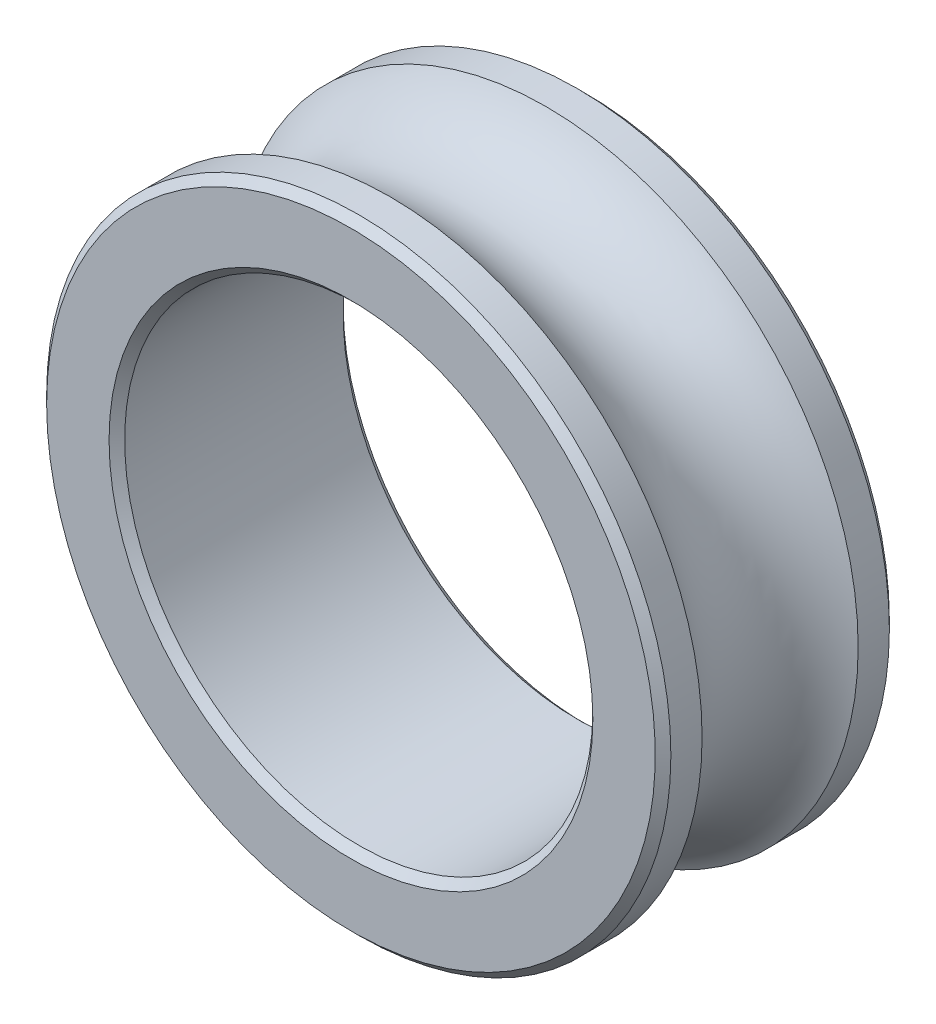
ISO-10303-21;
HEADER;
FILE_DESCRIPTION(('STEP AP214'),'2;1');
FILE_NAME('part.step','',(''),(''),'','','');
FILE_SCHEMA(('AUTOMOTIVE_DESIGN { 1 0 10303 214 1 1 1 1 }'));
ENDSEC;
DATA;
#1=APPLICATION_CONTEXT('core data for automotive mechanical design processes');
#2=APPLICATION_PROTOCOL_DEFINITION('international standard','automotive_design',2000,#1);
#3=PRODUCT_CONTEXT('',#1,'mechanical');
#4=PRODUCT('Part','Part','',(#3));
#5=PRODUCT_RELATED_PRODUCT_CATEGORY('part','',(#4));
#6=PRODUCT_DEFINITION_FORMATION('','',#4);
#7=PRODUCT_DEFINITION_CONTEXT('part definition',#1,'design');
#8=PRODUCT_DEFINITION('design','',#6,#7);
#9=PRODUCT_DEFINITION_SHAPE('','',#8);
#10=(LENGTH_UNIT() NAMED_UNIT(*) SI_UNIT(.MILLI.,.METRE.));
#11=(NAMED_UNIT(*) PLANE_ANGLE_UNIT() SI_UNIT($,.RADIAN.));
#12=(NAMED_UNIT(*) SI_UNIT($,.STERADIAN.) SOLID_ANGLE_UNIT());
#13=UNCERTAINTY_MEASURE_WITH_UNIT(LENGTH_MEASURE(1.E-05),#10,'distance_accuracy_value','');
#14=(GEOMETRIC_REPRESENTATION_CONTEXT(3) GLOBAL_UNCERTAINTY_ASSIGNED_CONTEXT((#13)) GLOBAL_UNIT_ASSIGNED_CONTEXT((#10,
#11,#12)) REPRESENTATION_CONTEXT('',''));
#15=CARTESIAN_POINT('',(0.,0.,0.));
#16=DIRECTION('',(0.,0.,1.));
#17=DIRECTION('',(1.,0.,0.));
#18=AXIS2_PLACEMENT_3D('',#15,#16,#17);
#19=CARTESIAN_POINT('',(0.,0.,0.));
#20=DIRECTION('',(0.,0.,1.));
#21=DIRECTION('',(1.,0.,0.));
#22=AXIS2_PLACEMENT_3D('',#19,#20,#21);
#23=TOROIDAL_SURFACE('',#22,1156.93281819264,290.479016873371);
#24=CARTESIAN_POINT('',(0.,0.,254.));
#25=DIRECTION('',(0.,0.,1.));
#26=DIRECTION('',(1.,0.,0.));
#27=AXIS2_PLACEMENT_3D('',#24,#25,#26);
#28=CIRCLE('',#27,1016.);
#29=CARTESIAN_POINT('',(1016.,0.,254.));
#30=VERTEX_POINT('',#29);
#31=EDGE_CURVE('E67',#30,#30,#28,.T.);
#32=ORIENTED_EDGE('',*,*,#31,.F.);
#33=EDGE_LOOP('',(#32));
#34=FACE_BOUND('',#33,.T.);
#35=CARTESIAN_POINT('',(0.,0.,-254.));
#36=DIRECTION('',(0.,0.,1.));
#37=DIRECTION('',(1.,0.,0.));
#38=AXIS2_PLACEMENT_3D('',#35,#36,#37);
#39=CIRCLE('',#38,1016.);
#40=CARTESIAN_POINT('',(1016.,0.,-254.));
#41=VERTEX_POINT('',#40);
#42=EDGE_CURVE('E70',#41,#41,#39,.T.);
#43=ORIENTED_EDGE('',*,*,#42,.T.);
#44=EDGE_LOOP('',(#43));
#45=FACE_BOUND('',#44,.T.);
#46=ADVANCED_FACE('F35',(#34,#45),#23,.F.);
#47=CARTESIAN_POINT('',(0.,0.,0.));
#48=DIRECTION('',(0.,0.,1.));
#49=DIRECTION('',(1.,0.,0.));
#50=AXIS2_PLACEMENT_3D('',#47,#48,#49);
#51=CYLINDRICAL_SURFACE('',#50,1016.);
#52=CARTESIAN_POINT('',(0.,0.,355.6));
#53=DIRECTION('',(0.,0.,-1.));
#54=DIRECTION('',(-1.,0.,0.));
#55=AXIS2_PLACEMENT_3D('',#52,#53,#54);
#56=CIRCLE('',#55,1016.);
#57=CARTESIAN_POINT('',(-1016.,0.,355.6));
#58=VERTEX_POINT('',#57);
#59=EDGE_CURVE('E58',#58,#58,#56,.T.);
#60=ORIENTED_EDGE('',*,*,#59,.T.);
#61=EDGE_LOOP('',(#60));
#62=FACE_BOUND('',#61,.T.);
#63=ORIENTED_EDGE('',*,*,#31,.T.);
#64=EDGE_LOOP('',(#63));
#65=FACE_BOUND('',#64,.T.);
#66=ADVANCED_FACE('F91',(#62,#65),#51,.T.);
#67=CARTESIAN_POINT('',(0.,762.,381.));
#68=DIRECTION('',(0.,0.,-1.));
#69=DIRECTION('',(-1.,0.,0.));
#70=AXIS2_PLACEMENT_3D('',#67,#68,#69);
#71=PLANE('',#70);
#72=CARTESIAN_POINT('',(0.,0.,381.));
#73=DIRECTION('',(0.,0.,-1.));
#74=DIRECTION('',(-1.,0.,0.));
#75=AXIS2_PLACEMENT_3D('',#72,#73,#74);
#76=CIRCLE('',#75,990.6);
#77=CARTESIAN_POINT('',(-990.6,0.,381.));
#78=VERTEX_POINT('',#77);
#79=EDGE_CURVE('E61',#78,#78,#76,.F.);
#80=ORIENTED_EDGE('',*,*,#79,.T.);
#81=EDGE_LOOP('',(#80));
#82=FACE_BOUND('',#81,.T.);
#83=CARTESIAN_POINT('',(0.,0.,381.));
#84=DIRECTION('',(0.,0.,-1.));
#85=DIRECTION('',(-1.,0.,0.));
#86=AXIS2_PLACEMENT_3D('',#83,#84,#85);
#87=CIRCLE('',#86,787.4);
#88=CARTESIAN_POINT('',(787.4,0.,381.));
#89=VERTEX_POINT('',#88);
#90=EDGE_CURVE('E64',#89,#89,#87,.T.);
#91=ORIENTED_EDGE('',*,*,#90,.T.);
#92=EDGE_LOOP('',(#91));
#93=FACE_BOUND('',#92,.T.);
#94=ADVANCED_FACE('F97',(#82,#93),#71,.F.);
#95=CARTESIAN_POINT('',(0.,0.,0.));
#96=DIRECTION('',(0.,0.,1.));
#97=DIRECTION('',(1.,0.,0.));
#98=AXIS2_PLACEMENT_3D('',#95,#96,#97);
#99=CYLINDRICAL_SURFACE('',#98,762.);
#100=CARTESIAN_POINT('',(0.,0.,355.6));
#101=DIRECTION('',(0.,0.,-1.));
#102=DIRECTION('',(-1.,0.,0.));
#103=AXIS2_PLACEMENT_3D('',#100,#101,#102);
#104=CIRCLE('',#103,762.);
#105=CARTESIAN_POINT('',(762.,0.,355.600000000001));
#106=VERTEX_POINT('',#105);
#107=EDGE_CURVE('E50',#106,#106,#104,.F.);
#108=ORIENTED_EDGE('',*,*,#107,.T.);
#109=EDGE_LOOP('',(#108));
#110=FACE_BOUND('',#109,.T.);
#111=CARTESIAN_POINT('',(0.,0.,-355.6));
#112=DIRECTION('',(0.,0.,1.));
#113=DIRECTION('',(1.,0.,0.));
#114=AXIS2_PLACEMENT_3D('',#111,#112,#113);
#115=CIRCLE('',#114,762.);
#116=CARTESIAN_POINT('',(762.,0.,-355.6));
#117=VERTEX_POINT('',#116);
#118=EDGE_CURVE('E55',#117,#117,#115,.F.);
#119=ORIENTED_EDGE('',*,*,#118,.T.);
#120=EDGE_LOOP('',(#119));
#121=FACE_BOUND('',#120,.T.);
#122=ADVANCED_FACE('F88',(#110,#121),#99,.F.);
#123=CARTESIAN_POINT('',(0.,762.,-381.));
#124=DIRECTION('',(0.,0.,1.));
#125=DIRECTION('',(1.,0.,0.));
#126=AXIS2_PLACEMENT_3D('',#123,#124,#125);
#127=PLANE('',#126);
#128=CARTESIAN_POINT('',(0.,0.,-381.));
#129=DIRECTION('',(0.,0.,1.));
#130=DIRECTION('',(1.,0.,0.));
#131=AXIS2_PLACEMENT_3D('',#128,#129,#130);
#132=CIRCLE('',#131,990.6);
#133=CARTESIAN_POINT('',(990.6,0.,-381.));
#134=VERTEX_POINT('',#133);
#135=EDGE_CURVE('E10',#134,#134,#132,.F.);
#136=ORIENTED_EDGE('',*,*,#135,.T.);
#137=EDGE_LOOP('',(#136));
#138=FACE_BOUND('',#137,.T.);
#139=CARTESIAN_POINT('',(0.,0.,-381.));
#140=DIRECTION('',(0.,0.,1.));
#141=DIRECTION('',(1.,0.,0.));
#142=AXIS2_PLACEMENT_3D('',#139,#140,#141);
#143=CIRCLE('',#142,787.4);
#144=CARTESIAN_POINT('',(787.4,0.,-381.));
#145=VERTEX_POINT('',#144);
#146=EDGE_CURVE('E42',#145,#145,#143,.T.);
#147=ORIENTED_EDGE('',*,*,#146,.T.);
#148=EDGE_LOOP('',(#147));
#149=FACE_BOUND('',#148,.T.);
#150=ADVANCED_FACE('F78',(#138,#149),#127,.F.);
#151=CARTESIAN_POINT('',(0.,0.,0.));
#152=DIRECTION('',(0.,0.,1.));
#153=DIRECTION('',(1.,0.,0.));
#154=AXIS2_PLACEMENT_3D('',#151,#152,#153);
#155=CYLINDRICAL_SURFACE('',#154,1016.);
#156=CARTESIAN_POINT('',(0.,0.,-355.6));
#157=DIRECTION('',(0.,0.,1.));
#158=DIRECTION('',(1.,0.,0.));
#159=AXIS2_PLACEMENT_3D('',#156,#157,#158);
#160=CIRCLE('',#159,1016.);
#161=CARTESIAN_POINT('',(1016.,0.,-355.6));
#162=VERTEX_POINT('',#161);
#163=EDGE_CURVE('E46',#162,#162,#160,.T.);
#164=ORIENTED_EDGE('',*,*,#163,.T.);
#165=EDGE_LOOP('',(#164));
#166=FACE_BOUND('',#165,.T.);
#167=ORIENTED_EDGE('',*,*,#42,.F.);
#168=EDGE_LOOP('',(#167));
#169=FACE_BOUND('',#168,.T.);
#170=ADVANCED_FACE('F75',(#166,#169),#155,.T.);
#171=CARTESIAN_POINT('',(0.,0.,381.));
#172=DIRECTION('',(0.,0.,-1.));
#173=DIRECTION('',(-1.,0.,0.));
#174=AXIS2_PLACEMENT_3D('',#171,#172,#173);
#175=CONICAL_SURFACE('',#174,990.6,0.785398163397457);
#176=ORIENTED_EDGE('',*,*,#59,.F.);
#177=EDGE_LOOP('',(#176));
#178=FACE_BOUND('',#177,.T.);
#179=ORIENTED_EDGE('',*,*,#79,.F.);
#180=EDGE_LOOP('',(#179));
#181=FACE_BOUND('',#180,.T.);
#182=ADVANCED_FACE('F77',(#178,#181),#175,.T.);
#183=CARTESIAN_POINT('',(0.,0.,355.6));
#184=DIRECTION('',(0.,0.,1.));
#185=DIRECTION('',(1.,0.,0.));
#186=AXIS2_PLACEMENT_3D('',#183,#184,#185);
#187=CONICAL_SURFACE('',#186,762.,0.785398163397457);
#188=CARTESIAN_POINT('',(787.4,0.,381.));
#189=CARTESIAN_POINT('',(787.135416666667,0.,380.735416666667));
#190=CARTESIAN_POINT('',(786.870833333333,0.,380.470833333333));
#191=CARTESIAN_POINT('',(786.341666666667,0.,379.941666666667));
#192=CARTESIAN_POINT('',(786.077083333333,0.,379.677083333333));
#193=CARTESIAN_POINT('',(785.547916666667,0.,379.147916666667));
#194=CARTESIAN_POINT('',(785.283333333333,0.,378.883333333333));
#195=CARTESIAN_POINT('',(784.754166666667,0.,378.354166666667));
#196=CARTESIAN_POINT('',(784.489583333333,0.,378.089583333333));
#197=CARTESIAN_POINT('',(783.960416666667,0.,377.560416666667));
#198=CARTESIAN_POINT('',(783.695833333333,0.,377.295833333333));
#199=CARTESIAN_POINT('',(783.166666666667,0.,376.766666666667));
#200=CARTESIAN_POINT('',(782.902083333333,0.,376.502083333333));
#201=CARTESIAN_POINT('',(782.372916666667,0.,375.972916666667));
#202=CARTESIAN_POINT('',(782.108333333333,0.,375.708333333333));
#203=CARTESIAN_POINT('',(781.579166666667,0.,375.179166666667));
#204=CARTESIAN_POINT('',(781.314583333333,0.,374.914583333333));
#205=CARTESIAN_POINT('',(780.785416666667,0.,374.385416666667));
#206=CARTESIAN_POINT('',(780.520833333333,0.,374.120833333334));
#207=CARTESIAN_POINT('',(779.991666666667,0.,373.591666666667));
#208=CARTESIAN_POINT('',(779.727083333333,0.,373.327083333334));
#209=CARTESIAN_POINT('',(779.197916666667,0.,372.797916666667));
#210=CARTESIAN_POINT('',(778.933333333333,0.,372.533333333334));
#211=CARTESIAN_POINT('',(778.404166666667,0.,372.004166666667));
#212=CARTESIAN_POINT('',(778.139583333333,0.,371.739583333334));
#213=CARTESIAN_POINT('',(777.610416666667,0.,371.210416666667));
#214=CARTESIAN_POINT('',(777.345833333333,0.,370.945833333334));
#215=CARTESIAN_POINT('',(776.816666666667,0.,370.416666666667));
#216=CARTESIAN_POINT('',(776.552083333333,0.,370.152083333334));
#217=CARTESIAN_POINT('',(776.022916666667,0.,369.622916666667));
#218=CARTESIAN_POINT('',(775.758333333333,0.,369.358333333334));
#219=CARTESIAN_POINT('',(775.229166666667,0.,368.829166666667));
#220=CARTESIAN_POINT('',(774.964583333333,0.,368.564583333334));
#221=CARTESIAN_POINT('',(774.435416666667,0.,368.035416666667));
#222=CARTESIAN_POINT('',(774.170833333333,0.,367.770833333334));
#223=CARTESIAN_POINT('',(773.641666666667,0.,367.241666666667));
#224=CARTESIAN_POINT('',(773.377083333333,0.,366.977083333334));
#225=CARTESIAN_POINT('',(772.847916666667,0.,366.447916666667));
#226=CARTESIAN_POINT('',(772.583333333333,0.,366.183333333334));
#227=CARTESIAN_POINT('',(772.054166666667,0.,365.654166666667));
#228=CARTESIAN_POINT('',(771.789583333333,0.,365.389583333334));
#229=CARTESIAN_POINT('',(771.260416666667,0.,364.860416666667));
#230=CARTESIAN_POINT('',(770.995833333333,0.,364.595833333334));
#231=CARTESIAN_POINT('',(770.466666666667,0.,364.066666666667));
#232=CARTESIAN_POINT('',(770.202083333333,0.,363.802083333334));
#233=CARTESIAN_POINT('',(769.672916666667,0.,363.272916666667));
#234=CARTESIAN_POINT('',(769.408333333333,0.,363.008333333334));
#235=CARTESIAN_POINT('',(768.879166666667,0.,362.479166666667));
#236=CARTESIAN_POINT('',(768.614583333333,0.,362.214583333334));
#237=CARTESIAN_POINT('',(768.085416666667,0.,361.685416666667));
#238=CARTESIAN_POINT('',(767.820833333333,0.,361.420833333334));
#239=CARTESIAN_POINT('',(767.291666666667,0.,360.891666666667));
#240=CARTESIAN_POINT('',(767.027083333333,0.,360.627083333334));
#241=CARTESIAN_POINT('',(766.497916666667,0.,360.097916666667));
#242=CARTESIAN_POINT('',(766.233333333333,0.,359.833333333334));
#243=CARTESIAN_POINT('',(765.704166666667,0.,359.304166666667));
#244=CARTESIAN_POINT('',(765.439583333333,0.,359.039583333334));
#245=CARTESIAN_POINT('',(764.910416666667,0.,358.510416666667));
#246=CARTESIAN_POINT('',(764.645833333333,0.,358.245833333334));
#247=CARTESIAN_POINT('',(764.116666666667,0.,357.716666666667));
#248=CARTESIAN_POINT('',(763.852083333333,0.,357.452083333334));
#249=CARTESIAN_POINT('',(763.322916666667,0.,356.922916666667));
#250=CARTESIAN_POINT('',(763.058333333333,0.,356.658333333334));
#251=CARTESIAN_POINT('',(762.529166666667,0.,356.129166666667));
#252=CARTESIAN_POINT('',(762.264583333333,0.,355.864583333334));
#253=CARTESIAN_POINT('',(762.,0.,355.6));
#254=B_SPLINE_CURVE_WITH_KNOTS('',3,(#188,#189,#190,#191,#192,#193,#194,#195,#196,#197,#198,
#199,#200,#201,#202,#203,#204,#205,#206,#207,#208,#209,#210,#211,#212,#213,#214,#215,#216,#217,
#218,#219,#220,#221,#222,#223,#224,#225,#226,#227,#228,#229,#230,#231,#232,#233,#234,#235,#236,
#237,#238,#239,#240,#241,#242,#243,#244,#245,#246,#247,#248,#249,#250,#251,#252,#253),
.UNSPECIFIED.,.F.,.F.,(4,2,2,2,2,2,2,2,2,2,2,2,2,2,2,2,2,2,2,2,2,2,2,2,2,2,2,2,2,2,2,2,4),(0.,
1.12253201513358,2.24506403026728,3.36759604540093,4.49012806053451,5.61266007566817,
6.73519209080183,7.85772410593541,8.98025612106907,10.1027881362027,11.2253201513363,
12.34785216647,13.4703841816036,14.5929161967372,15.7154482118709,16.8379802270045,
17.9605122421381,19.0830442572718,20.2055762724054,21.328108287539,22.4506403026727,
23.5731723178063,24.6957043329399,25.8182363480736,26.9407683632072,28.0633003783408,
29.1858323934745,30.3083644086081,31.4308964237417,32.5534284388754,33.675960454009,
34.7984924691426,35.9210244842763),.UNSPECIFIED.);
#255=EDGE_CURVE('BSEAM85',#89,#106,#254,.T.);
#256=ORIENTED_EDGE('',*,*,#90,.F.);
#257=ORIENTED_EDGE('',*,*,#107,.F.);
#258=ORIENTED_EDGE('',*,*,#255,.T.);
#259=ORIENTED_EDGE('',*,*,#255,.F.);
#260=EDGE_LOOP('',(#256,#258,#257,#259));
#261=FACE_BOUND('',#260,.T.);
#262=ADVANCED_FACE('F85',(#261),#187,.F.);
#263=CARTESIAN_POINT('',(0.,0.,-355.6));
#264=DIRECTION('',(0.,0.,1.));
#265=DIRECTION('',(1.,0.,0.));
#266=AXIS2_PLACEMENT_3D('',#263,#264,#265);
#267=CONICAL_SURFACE('',#266,1016.,0.785398163397457);
#268=ORIENTED_EDGE('',*,*,#135,.F.);
#269=EDGE_LOOP('',(#268));
#270=FACE_BOUND('',#269,.T.);
#271=ORIENTED_EDGE('',*,*,#163,.F.);
#272=EDGE_LOOP('',(#271));
#273=FACE_BOUND('',#272,.T.);
#274=ADVANCED_FACE('F104',(#270,#273),#267,.T.);
#275=CARTESIAN_POINT('',(0.,0.,-381.));
#276=DIRECTION('',(0.,0.,-1.));
#277=DIRECTION('',(-1.,0.,0.));
#278=AXIS2_PLACEMENT_3D('',#275,#276,#277);
#279=CONICAL_SURFACE('',#278,787.4,0.785398163397446);
#280=ORIENTED_EDGE('',*,*,#118,.F.);
#281=EDGE_LOOP('',(#280));
#282=FACE_BOUND('',#281,.T.);
#283=ORIENTED_EDGE('',*,*,#146,.F.);
#284=EDGE_LOOP('',(#283));
#285=FACE_BOUND('',#284,.T.);
#286=ADVANCED_FACE('F37',(#282,#285),#279,.F.);
#287=CLOSED_SHELL('',(#46,#66,#94,#122,#150,#170,#182,#262,#274,#286));
#288=MANIFOLD_SOLID_BREP('B2',#287);
#289=ADVANCED_BREP_SHAPE_REPRESENTATION('',(#18,#288),#14);
#290=SHAPE_DEFINITION_REPRESENTATION(#9,#289);
ENDSEC;
END-ISO-10303-21;
